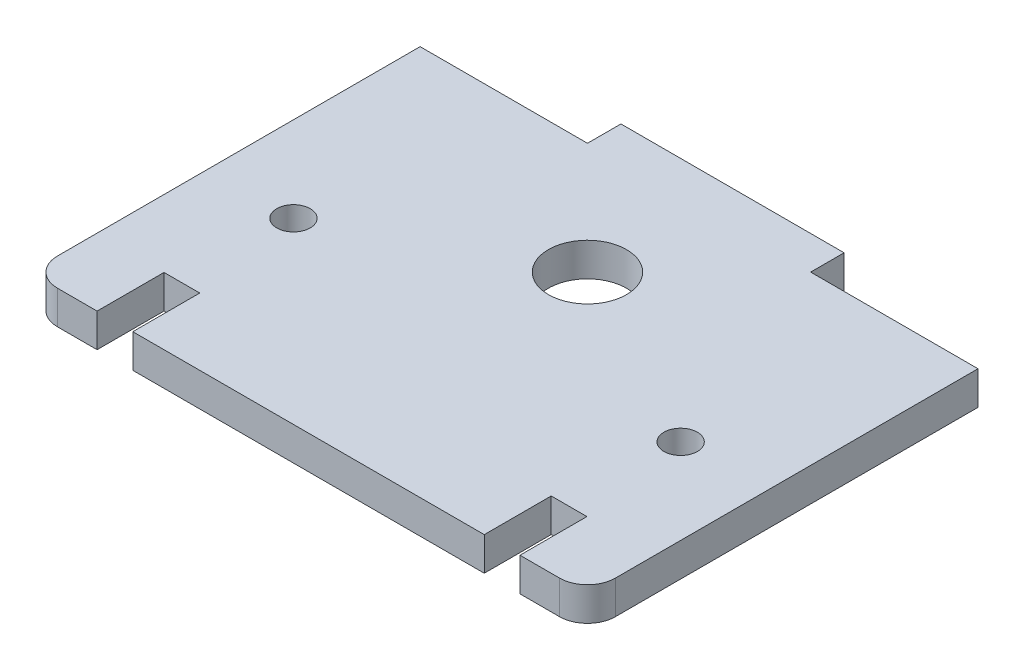
ISO-10303-21;
HEADER;
FILE_DESCRIPTION(('STEP AP214'),'2;1');
FILE_NAME('part.step','',(''),(''),'','','');
FILE_SCHEMA(('AUTOMOTIVE_DESIGN { 1 0 10303 214 1 1 1 1 }'));
ENDSEC;
DATA;
#1=APPLICATION_CONTEXT('core data for automotive mechanical design processes');
#2=APPLICATION_PROTOCOL_DEFINITION('international standard','automotive_design',2000,#1);
#3=PRODUCT_CONTEXT('',#1,'mechanical');
#4=PRODUCT('Part','Part','',(#3));
#5=PRODUCT_RELATED_PRODUCT_CATEGORY('part','',(#4));
#6=PRODUCT_DEFINITION_FORMATION('','',#4);
#7=PRODUCT_DEFINITION_CONTEXT('part definition',#1,'design');
#8=PRODUCT_DEFINITION('design','',#6,#7);
#9=PRODUCT_DEFINITION_SHAPE('','',#8);
#10=(LENGTH_UNIT() NAMED_UNIT(*) SI_UNIT(.MILLI.,.METRE.));
#11=(NAMED_UNIT(*) PLANE_ANGLE_UNIT() SI_UNIT($,.RADIAN.));
#12=(NAMED_UNIT(*) SI_UNIT($,.STERADIAN.) SOLID_ANGLE_UNIT());
#13=UNCERTAINTY_MEASURE_WITH_UNIT(LENGTH_MEASURE(1.E-05),#10,'distance_accuracy_value','');
#14=(GEOMETRIC_REPRESENTATION_CONTEXT(3) GLOBAL_UNCERTAINTY_ASSIGNED_CONTEXT((#13)) GLOBAL_UNIT_ASSIGNED_CONTEXT((#10,
#11,#12)) REPRESENTATION_CONTEXT('',''));
#15=CARTESIAN_POINT('',(0.,0.,0.));
#16=DIRECTION('',(0.,0.,1.));
#17=DIRECTION('',(1.,0.,0.));
#18=AXIS2_PLACEMENT_3D('',#15,#16,#17);
#19=CARTESIAN_POINT('',(25.,3.,-17.5));
#20=DIRECTION('',(0.,0.,1.));
#21=DIRECTION('',(1.,0.,0.));
#22=AXIS2_PLACEMENT_3D('',#19,#20,#21);
#23=PLANE('',#22);
#24=DIRECTION('',(0.,-1.,0.));
#25=VECTOR('',#24,1.);
#26=CARTESIAN_POINT('',(10.0000000000001,0.,-17.5));
#27=LINE('',#26,#25);
#28=CARTESIAN_POINT('',(10.0000000000001,3.,-17.5));
#29=VERTEX_POINT('',#28);
#30=CARTESIAN_POINT('',(10.0000000000001,0.,-17.5));
#31=VERTEX_POINT('',#30);
#32=EDGE_CURVE('E54',#29,#31,#27,.T.);
#33=ORIENTED_EDGE('',*,*,#32,.F.);
#34=DIRECTION('',(-1.,0.,0.));
#35=VECTOR('',#34,1.);
#36=CARTESIAN_POINT('',(25.,3.,-17.5));
#37=LINE('',#36,#35);
#38=CARTESIAN_POINT('',(25.,3.,-17.5));
#39=VERTEX_POINT('',#38);
#40=EDGE_CURVE('E242',#39,#29,#37,.T.);
#41=ORIENTED_EDGE('',*,*,#40,.F.);
#42=DIRECTION('',(0.,-1.,0.));
#43=VECTOR('',#42,1.);
#44=CARTESIAN_POINT('',(25.,3.,-17.5));
#45=LINE('',#44,#43);
#46=CARTESIAN_POINT('',(25.,0.,-17.5));
#47=VERTEX_POINT('',#46);
#48=EDGE_CURVE('E275',#39,#47,#45,.T.);
#49=ORIENTED_EDGE('',*,*,#48,.T.);
#50=DIRECTION('',(-1.,0.,0.));
#51=VECTOR('',#50,1.);
#52=CARTESIAN_POINT('',(25.,0.,-17.5));
#53=LINE('',#52,#51);
#54=EDGE_CURVE('E217',#47,#31,#53,.T.);
#55=ORIENTED_EDGE('',*,*,#54,.T.);
#56=EDGE_LOOP('',(#33,#41,#49,#55));
#57=FACE_BOUND('',#56,.T.);
#58=ADVANCED_FACE('F39',(#57),#23,.F.);
#59=DIRECTION('',(0.,1.,0.));
#60=VECTOR('',#59,1.);
#61=CARTESIAN_POINT('',(-10.0000000000001,0.,-17.5));
#62=LINE('',#61,#60);
#63=CARTESIAN_POINT('',(-10.0000000000001,0.,-17.5));
#64=VERTEX_POINT('',#63);
#65=CARTESIAN_POINT('',(-10.0000000000001,3.,-17.5));
#66=VERTEX_POINT('',#65);
#67=EDGE_CURVE('E62',#64,#66,#62,.T.);
#68=ORIENTED_EDGE('',*,*,#67,.F.);
#69=CARTESIAN_POINT('',(-25.,0.,-17.5));
#70=VERTEX_POINT('',#69);
#71=EDGE_CURVE('E271',#64,#70,#53,.T.);
#72=ORIENTED_EDGE('',*,*,#71,.T.);
#73=DIRECTION('',(0.,-1.,0.));
#74=VECTOR('',#73,1.);
#75=CARTESIAN_POINT('',(-25.,3.,-17.5));
#76=LINE('',#75,#74);
#77=CARTESIAN_POINT('',(-25.,3.,-17.5));
#78=VERTEX_POINT('',#77);
#79=EDGE_CURVE('E244',#78,#70,#76,.T.);
#80=ORIENTED_EDGE('',*,*,#79,.F.);
#81=EDGE_CURVE('E241',#66,#78,#37,.T.);
#82=ORIENTED_EDGE('',*,*,#81,.F.);
#83=EDGE_LOOP('',(#68,#72,#80,#82));
#84=FACE_BOUND('',#83,.T.);
#85=ADVANCED_FACE('F392',(#84),#23,.F.);
#86=CARTESIAN_POINT('',(22.5,3.,15.));
#87=DIRECTION('',(0.,1.,0.));
#88=DIRECTION('',(0.,0.,1.));
#89=AXIS2_PLACEMENT_3D('',#86,#87,#88);
#90=PLANE('',#89);
#91=CARTESIAN_POINT('',(17.35,3.,1.5));
#92=DIRECTION('',(0.,1.,0.));
#93=DIRECTION('',(0.,0.,-1.));
#94=AXIS2_PLACEMENT_3D('',#91,#92,#93);
#95=CIRCLE('',#94,1.5);
#96=CARTESIAN_POINT('',(17.35,3.,0.));
#97=VERTEX_POINT('',#96);
#98=EDGE_CURVE('E201',#97,#97,#95,.T.);
#99=ORIENTED_EDGE('',*,*,#98,.F.);
#100=EDGE_LOOP('',(#99));
#101=FACE_BOUND('',#100,.T.);
#102=DIRECTION('',(0.,0.,1.));
#103=VECTOR('',#102,1.);
#104=CARTESIAN_POINT('',(-25.,3.,15.));
#105=LINE('',#104,#103);
#106=CARTESIAN_POINT('',(-25.,3.,15.));
#107=VERTEX_POINT('',#106);
#108=EDGE_CURVE('E213',#78,#107,#105,.T.);
#109=ORIENTED_EDGE('',*,*,#108,.T.);
#110=CARTESIAN_POINT('',(-22.5,3.,15.));
#111=DIRECTION('',(0.,1.,0.));
#112=DIRECTION('',(0.,0.,-1.));
#113=AXIS2_PLACEMENT_3D('',#110,#111,#112);
#114=CIRCLE('',#113,2.5);
#115=CARTESIAN_POINT('',(-22.5,3.,17.5));
#116=VERTEX_POINT('',#115);
#117=EDGE_CURVE('E216',#107,#116,#114,.T.);
#118=ORIENTED_EDGE('',*,*,#117,.T.);
#119=DIRECTION('',(1.,0.,0.));
#120=VECTOR('',#119,1.);
#121=CARTESIAN_POINT('',(-18.95,3.,17.5));
#122=LINE('',#121,#120);
#123=CARTESIAN_POINT('',(-18.95,3.,17.5));
#124=VERTEX_POINT('',#123);
#125=EDGE_CURVE('E219',#116,#124,#122,.T.);
#126=ORIENTED_EDGE('',*,*,#125,.T.);
#127=DIRECTION('',(0.,0.,-1.));
#128=VECTOR('',#127,1.);
#129=CARTESIAN_POINT('',(-18.95,3.,17.5));
#130=LINE('',#129,#128);
#131=CARTESIAN_POINT('',(-18.95,3.,11.5));
#132=VERTEX_POINT('',#131);
#133=EDGE_CURVE('E221',#124,#132,#130,.T.);
#134=ORIENTED_EDGE('',*,*,#133,.T.);
#135=DIRECTION('',(1.,0.,0.));
#136=VECTOR('',#135,1.);
#137=CARTESIAN_POINT('',(-18.95,3.,11.5));
#138=LINE('',#137,#136);
#139=CARTESIAN_POINT('',(-15.75,3.,11.5));
#140=VERTEX_POINT('',#139);
#141=EDGE_CURVE('E223',#132,#140,#138,.T.);
#142=ORIENTED_EDGE('',*,*,#141,.T.);
#143=DIRECTION('',(0.,0.,1.));
#144=VECTOR('',#143,1.);
#145=CARTESIAN_POINT('',(-15.75,3.,11.5));
#146=LINE('',#145,#144);
#147=CARTESIAN_POINT('',(-15.75,3.,17.5));
#148=VERTEX_POINT('',#147);
#149=EDGE_CURVE('E225',#140,#148,#146,.T.);
#150=ORIENTED_EDGE('',*,*,#149,.T.);
#151=DIRECTION('',(1.,0.,0.));
#152=VECTOR('',#151,1.);
#153=CARTESIAN_POINT('',(15.75,3.,17.5));
#154=LINE('',#153,#152);
#155=CARTESIAN_POINT('',(15.75,3.,17.5));
#156=VERTEX_POINT('',#155);
#157=EDGE_CURVE('E227',#148,#156,#154,.T.);
#158=ORIENTED_EDGE('',*,*,#157,.T.);
#159=DIRECTION('',(0.,0.,-1.));
#160=VECTOR('',#159,1.);
#161=CARTESIAN_POINT('',(15.75,3.,11.5));
#162=LINE('',#161,#160);
#163=CARTESIAN_POINT('',(15.75,3.,11.5));
#164=VERTEX_POINT('',#163);
#165=EDGE_CURVE('E229',#156,#164,#162,.T.);
#166=ORIENTED_EDGE('',*,*,#165,.T.);
#167=DIRECTION('',(1.,0.,0.));
#168=VECTOR('',#167,1.);
#169=CARTESIAN_POINT('',(18.95,3.,11.5));
#170=LINE('',#169,#168);
#171=CARTESIAN_POINT('',(18.95,3.,11.5));
#172=VERTEX_POINT('',#171);
#173=EDGE_CURVE('E231',#164,#172,#170,.T.);
#174=ORIENTED_EDGE('',*,*,#173,.T.);
#175=DIRECTION('',(0.,0.,1.));
#176=VECTOR('',#175,1.);
#177=CARTESIAN_POINT('',(18.95,3.,17.5));
#178=LINE('',#177,#176);
#179=CARTESIAN_POINT('',(18.95,3.,17.5));
#180=VERTEX_POINT('',#179);
#181=EDGE_CURVE('E233',#172,#180,#178,.T.);
#182=ORIENTED_EDGE('',*,*,#181,.T.);
#183=DIRECTION('',(1.,0.,0.));
#184=VECTOR('',#183,1.);
#185=CARTESIAN_POINT('',(22.5,3.,17.5));
#186=LINE('',#185,#184);
#187=CARTESIAN_POINT('',(22.5,3.,17.5));
#188=VERTEX_POINT('',#187);
#189=EDGE_CURVE('E235',#180,#188,#186,.T.);
#190=ORIENTED_EDGE('',*,*,#189,.T.);
#191=CARTESIAN_POINT('',(22.5,3.,15.));
#192=DIRECTION('',(0.,1.,0.));
#193=DIRECTION('',(0.,0.,1.));
#194=AXIS2_PLACEMENT_3D('',#191,#192,#193);
#195=CIRCLE('',#194,2.5);
#196=CARTESIAN_POINT('',(25.,3.,15.));
#197=VERTEX_POINT('',#196);
#198=EDGE_CURVE('E237',#188,#197,#195,.T.);
#199=ORIENTED_EDGE('',*,*,#198,.T.);
#200=DIRECTION('',(0.,0.,-1.));
#201=VECTOR('',#200,1.);
#202=CARTESIAN_POINT('',(25.,3.,15.));
#203=LINE('',#202,#201);
#204=EDGE_CURVE('E239',#197,#39,#203,.T.);
#205=ORIENTED_EDGE('',*,*,#204,.T.);
#206=ORIENTED_EDGE('',*,*,#40,.T.);
#207=DIRECTION('',(0.,0.,1.));
#208=VECTOR('',#207,1.);
#209=CARTESIAN_POINT('',(10.0000000000001,3.,-20.5));
#210=LINE('',#209,#208);
#211=CARTESIAN_POINT('',(10.0000000000001,3.,-20.5));
#212=VERTEX_POINT('',#211);
#213=EDGE_CURVE('E341',#212,#29,#210,.T.);
#214=ORIENTED_EDGE('',*,*,#213,.F.);
#215=DIRECTION('',(1.,0.,0.));
#216=VECTOR('',#215,1.);
#217=CARTESIAN_POINT('',(-10.0000000000001,3.,-20.5));
#218=LINE('',#217,#216);
#219=CARTESIAN_POINT('',(-10.0000000000001,3.,-20.5));
#220=VERTEX_POINT('',#219);
#221=EDGE_CURVE('E183',#220,#212,#218,.T.);
#222=ORIENTED_EDGE('',*,*,#221,.F.);
#223=DIRECTION('',(0.,0.,1.));
#224=VECTOR('',#223,1.);
#225=CARTESIAN_POINT('',(-10.0000000000001,3.,-20.5));
#226=LINE('',#225,#224);
#227=EDGE_CURVE('E194',#220,#66,#226,.T.);
#228=ORIENTED_EDGE('',*,*,#227,.T.);
#229=ORIENTED_EDGE('',*,*,#81,.T.);
#230=EDGE_LOOP('',(#109,#118,#126,#134,#142,#150,#158,#166,#174,#182,#190,#199,#205,#206,#214,
#222,#228,#229));
#231=FACE_BOUND('',#230,.T.);
#232=CARTESIAN_POINT('',(-17.35,3.,1.5));
#233=DIRECTION('',(0.,1.,0.));
#234=DIRECTION('',(0.,0.,1.));
#235=AXIS2_PLACEMENT_3D('',#232,#233,#234);
#236=CIRCLE('',#235,1.5);
#237=CARTESIAN_POINT('',(-17.35,3.,3.00000000000001));
#238=VERTEX_POINT('',#237);
#239=EDGE_CURVE('E207',#238,#238,#236,.T.);
#240=ORIENTED_EDGE('',*,*,#239,.F.);
#241=EDGE_LOOP('',(#240));
#242=FACE_BOUND('',#241,.T.);
#243=CARTESIAN_POINT('',(0.,3.,-7.5));
#244=DIRECTION('',(0.,1.,0.));
#245=DIRECTION('',(0.,0.,1.));
#246=AXIS2_PLACEMENT_3D('',#243,#244,#245);
#247=CIRCLE('',#246,3.5);
#248=CARTESIAN_POINT('',(0.,3.,-4.));
#249=VERTEX_POINT('',#248);
#250=EDGE_CURVE('E192',#249,#249,#247,.T.);
#251=ORIENTED_EDGE('',*,*,#250,.F.);
#252=EDGE_LOOP('',(#251));
#253=FACE_BOUND('',#252,.T.);
#254=ADVANCED_FACE('F328',(#101,#231,#242,#253),#90,.T.);
#255=CARTESIAN_POINT('',(22.5,0.,15.));
#256=DIRECTION('',(0.,1.,0.));
#257=DIRECTION('',(0.,0.,1.));
#258=AXIS2_PLACEMENT_3D('',#255,#256,#257);
#259=PLANE('',#258);
#260=DIRECTION('',(0.,0.,1.));
#261=VECTOR('',#260,1.);
#262=CARTESIAN_POINT('',(-25.,0.,15.));
#263=LINE('',#262,#261);
#264=CARTESIAN_POINT('',(-25.,0.,15.));
#265=VERTEX_POINT('',#264);
#266=EDGE_CURVE('E210',#70,#265,#263,.T.);
#267=ORIENTED_EDGE('',*,*,#266,.F.);
#268=ORIENTED_EDGE('',*,*,#71,.F.);
#269=DIRECTION('',(0.,0.,1.));
#270=VECTOR('',#269,1.);
#271=CARTESIAN_POINT('',(-10.0000000000001,0.,-20.5));
#272=LINE('',#271,#270);
#273=CARTESIAN_POINT('',(-10.0000000000001,0.,-20.5));
#274=VERTEX_POINT('',#273);
#275=EDGE_CURVE('E174',#274,#64,#272,.T.);
#276=ORIENTED_EDGE('',*,*,#275,.F.);
#277=DIRECTION('',(-1.,0.,0.));
#278=VECTOR('',#277,1.);
#279=CARTESIAN_POINT('',(-10.0000000000001,0.,-20.5));
#280=LINE('',#279,#278);
#281=CARTESIAN_POINT('',(10.0000000000001,0.,-20.5));
#282=VERTEX_POINT('',#281);
#283=EDGE_CURVE('E165',#282,#274,#280,.T.);
#284=ORIENTED_EDGE('',*,*,#283,.F.);
#285=DIRECTION('',(0.,0.,1.));
#286=VECTOR('',#285,1.);
#287=CARTESIAN_POINT('',(10.0000000000001,0.,-20.5));
#288=LINE('',#287,#286);
#289=EDGE_CURVE('E172',#282,#31,#288,.T.);
#290=ORIENTED_EDGE('',*,*,#289,.T.);
#291=ORIENTED_EDGE('',*,*,#54,.F.);
#292=DIRECTION('',(0.,0.,-1.));
#293=VECTOR('',#292,1.);
#294=CARTESIAN_POINT('',(25.,0.,15.));
#295=LINE('',#294,#293);
#296=CARTESIAN_POINT('',(25.,0.,15.));
#297=VERTEX_POINT('',#296);
#298=EDGE_CURVE('E269',#297,#47,#295,.T.);
#299=ORIENTED_EDGE('',*,*,#298,.F.);
#300=CARTESIAN_POINT('',(22.5,0.,15.));
#301=DIRECTION('',(0.,1.,0.));
#302=DIRECTION('',(0.,0.,1.));
#303=AXIS2_PLACEMENT_3D('',#300,#301,#302);
#304=CIRCLE('',#303,2.5);
#305=CARTESIAN_POINT('',(22.5,0.,17.5));
#306=VERTEX_POINT('',#305);
#307=EDGE_CURVE('E267',#306,#297,#304,.T.);
#308=ORIENTED_EDGE('',*,*,#307,.F.);
#309=DIRECTION('',(1.,0.,0.));
#310=VECTOR('',#309,1.);
#311=CARTESIAN_POINT('',(22.5,0.,17.5));
#312=LINE('',#311,#310);
#313=CARTESIAN_POINT('',(18.95,0.,17.5));
#314=VERTEX_POINT('',#313);
#315=EDGE_CURVE('E265',#314,#306,#312,.T.);
#316=ORIENTED_EDGE('',*,*,#315,.F.);
#317=DIRECTION('',(0.,0.,1.));
#318=VECTOR('',#317,1.);
#319=CARTESIAN_POINT('',(18.95,0.,17.5));
#320=LINE('',#319,#318);
#321=CARTESIAN_POINT('',(18.95,0.,11.5));
#322=VERTEX_POINT('',#321);
#323=EDGE_CURVE('E263',#322,#314,#320,.T.);
#324=ORIENTED_EDGE('',*,*,#323,.F.);
#325=DIRECTION('',(1.,0.,0.));
#326=VECTOR('',#325,1.);
#327=CARTESIAN_POINT('',(18.95,0.,11.5));
#328=LINE('',#327,#326);
#329=CARTESIAN_POINT('',(15.75,0.,11.5));
#330=VERTEX_POINT('',#329);
#331=EDGE_CURVE('E261',#330,#322,#328,.T.);
#332=ORIENTED_EDGE('',*,*,#331,.F.);
#333=DIRECTION('',(0.,0.,-1.));
#334=VECTOR('',#333,1.);
#335=CARTESIAN_POINT('',(15.75,0.,11.5));
#336=LINE('',#335,#334);
#337=CARTESIAN_POINT('',(15.75,0.,17.5));
#338=VERTEX_POINT('',#337);
#339=EDGE_CURVE('E259',#338,#330,#336,.T.);
#340=ORIENTED_EDGE('',*,*,#339,.F.);
#341=DIRECTION('',(1.,0.,0.));
#342=VECTOR('',#341,1.);
#343=CARTESIAN_POINT('',(15.75,0.,17.5));
#344=LINE('',#343,#342);
#345=CARTESIAN_POINT('',(-15.75,0.,17.5));
#346=VERTEX_POINT('',#345);
#347=EDGE_CURVE('E257',#346,#338,#344,.T.);
#348=ORIENTED_EDGE('',*,*,#347,.F.);
#349=DIRECTION('',(0.,0.,1.));
#350=VECTOR('',#349,1.);
#351=CARTESIAN_POINT('',(-15.75,0.,11.5));
#352=LINE('',#351,#350);
#353=CARTESIAN_POINT('',(-15.75,0.,11.5));
#354=VERTEX_POINT('',#353);
#355=EDGE_CURVE('E255',#354,#346,#352,.T.);
#356=ORIENTED_EDGE('',*,*,#355,.F.);
#357=DIRECTION('',(1.,0.,0.));
#358=VECTOR('',#357,1.);
#359=CARTESIAN_POINT('',(-18.95,0.,11.5));
#360=LINE('',#359,#358);
#361=CARTESIAN_POINT('',(-18.95,0.,11.5));
#362=VERTEX_POINT('',#361);
#363=EDGE_CURVE('E253',#362,#354,#360,.T.);
#364=ORIENTED_EDGE('',*,*,#363,.F.);
#365=DIRECTION('',(0.,0.,-1.));
#366=VECTOR('',#365,1.);
#367=CARTESIAN_POINT('',(-18.95,0.,17.5));
#368=LINE('',#367,#366);
#369=CARTESIAN_POINT('',(-18.95,0.,17.5));
#370=VERTEX_POINT('',#369);
#371=EDGE_CURVE('E251',#370,#362,#368,.T.);
#372=ORIENTED_EDGE('',*,*,#371,.F.);
#373=DIRECTION('',(1.,0.,0.));
#374=VECTOR('',#373,1.);
#375=CARTESIAN_POINT('',(-18.95,0.,17.5));
#376=LINE('',#375,#374);
#377=CARTESIAN_POINT('',(-22.5,0.,17.5));
#378=VERTEX_POINT('',#377);
#379=EDGE_CURVE('E249',#378,#370,#376,.T.);
#380=ORIENTED_EDGE('',*,*,#379,.F.);
#381=CARTESIAN_POINT('',(-22.5,0.,15.));
#382=DIRECTION('',(0.,1.,0.));
#383=DIRECTION('',(0.,0.,-1.));
#384=AXIS2_PLACEMENT_3D('',#381,#382,#383);
#385=CIRCLE('',#384,2.5);
#386=EDGE_CURVE('E247',#265,#378,#385,.T.);
#387=ORIENTED_EDGE('',*,*,#386,.F.);
#388=EDGE_LOOP('',(#267,#268,#276,#284,#290,#291,#299,#308,#316,#324,#332,#340,#348,#356,#364,
#372,#380,#387));
#389=FACE_BOUND('',#388,.T.);
#390=CARTESIAN_POINT('',(-17.35,0.,1.5));
#391=DIRECTION('',(0.,1.,0.));
#392=DIRECTION('',(0.,0.,1.));
#393=AXIS2_PLACEMENT_3D('',#390,#391,#392);
#394=CIRCLE('',#393,1.5);
#395=CARTESIAN_POINT('',(-17.35,0.,3.00000000000001));
#396=VERTEX_POINT('',#395);
#397=EDGE_CURVE('E204',#396,#396,#394,.T.);
#398=ORIENTED_EDGE('',*,*,#397,.T.);
#399=EDGE_LOOP('',(#398));
#400=FACE_BOUND('',#399,.T.);
#401=CARTESIAN_POINT('',(17.35,0.,1.5));
#402=DIRECTION('',(0.,1.,0.));
#403=DIRECTION('',(0.,0.,-1.));
#404=AXIS2_PLACEMENT_3D('',#401,#402,#403);
#405=CIRCLE('',#404,1.5);
#406=CARTESIAN_POINT('',(17.35,0.,0.));
#407=VERTEX_POINT('',#406);
#408=EDGE_CURVE('E199',#407,#407,#405,.T.);
#409=ORIENTED_EDGE('',*,*,#408,.T.);
#410=EDGE_LOOP('',(#409));
#411=FACE_BOUND('',#410,.T.);
#412=CARTESIAN_POINT('',(0.,0.,-7.5));
#413=DIRECTION('',(0.,1.,0.));
#414=DIRECTION('',(0.,0.,1.));
#415=AXIS2_PLACEMENT_3D('',#412,#413,#414);
#416=CIRCLE('',#415,3.5);
#417=CARTESIAN_POINT('',(0.,0.,-4.));
#418=VERTEX_POINT('',#417);
#419=EDGE_CURVE('E189',#418,#418,#416,.T.);
#420=ORIENTED_EDGE('',*,*,#419,.T.);
#421=EDGE_LOOP('',(#420));
#422=FACE_BOUND('',#421,.T.);
#423=ADVANCED_FACE('F168',(#389,#400,#411,#422),#259,.F.);
#424=CARTESIAN_POINT('',(-25.,3.,15.));
#425=DIRECTION('',(1.,0.,0.));
#426=DIRECTION('',(0.,0.,-1.));
#427=AXIS2_PLACEMENT_3D('',#424,#425,#426);
#428=PLANE('',#427);
#429=ORIENTED_EDGE('',*,*,#266,.T.);
#430=DIRECTION('',(0.,-1.,0.));
#431=VECTOR('',#430,1.);
#432=CARTESIAN_POINT('',(-25.,3.,15.));
#433=LINE('',#432,#431);
#434=EDGE_CURVE('E11',#107,#265,#433,.T.);
#435=ORIENTED_EDGE('',*,*,#434,.F.);
#436=ORIENTED_EDGE('',*,*,#108,.F.);
#437=ORIENTED_EDGE('',*,*,#79,.T.);
#438=EDGE_LOOP('',(#429,#435,#436,#437));
#439=FACE_BOUND('',#438,.T.);
#440=ADVANCED_FACE('F41',(#439),#428,.F.);
#441=CARTESIAN_POINT('',(-22.5,3.,15.));
#442=DIRECTION('',(0.,-1.,0.));
#443=DIRECTION('',(0.,0.,-1.));
#444=AXIS2_PLACEMENT_3D('',#441,#442,#443);
#445=CYLINDRICAL_SURFACE('',#444,2.5);
#446=ORIENTED_EDGE('',*,*,#386,.T.);
#447=DIRECTION('',(0.,-1.,0.));
#448=VECTOR('',#447,1.);
#449=CARTESIAN_POINT('',(-22.5,3.,17.5));
#450=LINE('',#449,#448);
#451=EDGE_CURVE('E47',#116,#378,#450,.T.);
#452=ORIENTED_EDGE('',*,*,#451,.F.);
#453=ORIENTED_EDGE('',*,*,#117,.F.);
#454=ORIENTED_EDGE('',*,*,#434,.T.);
#455=EDGE_LOOP('',(#446,#452,#453,#454));
#456=FACE_BOUND('',#455,.T.);
#457=ADVANCED_FACE('F333',(#456),#445,.T.);
#458=CARTESIAN_POINT('',(-18.95,3.,17.5));
#459=DIRECTION('',(0.,0.,-1.));
#460=DIRECTION('',(-1.,0.,0.));
#461=AXIS2_PLACEMENT_3D('',#458,#459,#460);
#462=PLANE('',#461);
#463=ORIENTED_EDGE('',*,*,#379,.T.);
#464=DIRECTION('',(0.,-1.,0.));
#465=VECTOR('',#464,1.);
#466=CARTESIAN_POINT('',(-18.95,3.,17.5));
#467=LINE('',#466,#465);
#468=EDGE_CURVE('E305',#124,#370,#467,.T.);
#469=ORIENTED_EDGE('',*,*,#468,.F.);
#470=ORIENTED_EDGE('',*,*,#125,.F.);
#471=ORIENTED_EDGE('',*,*,#451,.T.);
#472=EDGE_LOOP('',(#463,#469,#470,#471));
#473=FACE_BOUND('',#472,.T.);
#474=ADVANCED_FACE('F312',(#473),#462,.F.);
#475=CARTESIAN_POINT('',(-18.95,3.,17.5));
#476=DIRECTION('',(-1.,0.,0.));
#477=DIRECTION('',(0.,0.,1.));
#478=AXIS2_PLACEMENT_3D('',#475,#476,#477);
#479=PLANE('',#478);
#480=ORIENTED_EDGE('',*,*,#371,.T.);
#481=DIRECTION('',(0.,-1.,0.));
#482=VECTOR('',#481,1.);
#483=CARTESIAN_POINT('',(-18.95,3.,11.5));
#484=LINE('',#483,#482);
#485=EDGE_CURVE('E302',#132,#362,#484,.T.);
#486=ORIENTED_EDGE('',*,*,#485,.F.);
#487=ORIENTED_EDGE('',*,*,#133,.F.);
#488=ORIENTED_EDGE('',*,*,#468,.T.);
#489=EDGE_LOOP('',(#480,#486,#487,#488));
#490=FACE_BOUND('',#489,.T.);
#491=ADVANCED_FACE('F320',(#490),#479,.F.);
#492=CARTESIAN_POINT('',(-18.95,3.,11.5));
#493=DIRECTION('',(0.,0.,-1.));
#494=DIRECTION('',(-1.,0.,0.));
#495=AXIS2_PLACEMENT_3D('',#492,#493,#494);
#496=PLANE('',#495);
#497=ORIENTED_EDGE('',*,*,#363,.T.);
#498=DIRECTION('',(0.,-1.,0.));
#499=VECTOR('',#498,1.);
#500=CARTESIAN_POINT('',(-15.75,3.,11.5));
#501=LINE('',#500,#499);
#502=EDGE_CURVE('E299',#140,#354,#501,.T.);
#503=ORIENTED_EDGE('',*,*,#502,.F.);
#504=ORIENTED_EDGE('',*,*,#141,.F.);
#505=ORIENTED_EDGE('',*,*,#485,.T.);
#506=EDGE_LOOP('',(#497,#503,#504,#505));
#507=FACE_BOUND('',#506,.T.);
#508=ADVANCED_FACE('F324',(#507),#496,.F.);
#509=CARTESIAN_POINT('',(-15.75,3.,11.5));
#510=DIRECTION('',(1.,0.,0.));
#511=DIRECTION('',(0.,0.,-1.));
#512=AXIS2_PLACEMENT_3D('',#509,#510,#511);
#513=PLANE('',#512);
#514=ORIENTED_EDGE('',*,*,#355,.T.);
#515=DIRECTION('',(0.,-1.,0.));
#516=VECTOR('',#515,1.);
#517=CARTESIAN_POINT('',(-15.75,3.,17.5));
#518=LINE('',#517,#516);
#519=EDGE_CURVE('E296',#148,#346,#518,.T.);
#520=ORIENTED_EDGE('',*,*,#519,.F.);
#521=ORIENTED_EDGE('',*,*,#149,.F.);
#522=ORIENTED_EDGE('',*,*,#502,.T.);
#523=EDGE_LOOP('',(#514,#520,#521,#522));
#524=FACE_BOUND('',#523,.T.);
#525=ADVANCED_FACE('F382',(#524),#513,.F.);
#526=CARTESIAN_POINT('',(15.75,3.,17.5));
#527=DIRECTION('',(0.,0.,-1.));
#528=DIRECTION('',(-1.,0.,0.));
#529=AXIS2_PLACEMENT_3D('',#526,#527,#528);
#530=PLANE('',#529);
#531=ORIENTED_EDGE('',*,*,#347,.T.);
#532=DIRECTION('',(0.,-1.,0.));
#533=VECTOR('',#532,1.);
#534=CARTESIAN_POINT('',(15.75,3.,17.5));
#535=LINE('',#534,#533);
#536=EDGE_CURVE('E293',#156,#338,#535,.T.);
#537=ORIENTED_EDGE('',*,*,#536,.F.);
#538=ORIENTED_EDGE('',*,*,#157,.F.);
#539=ORIENTED_EDGE('',*,*,#519,.T.);
#540=EDGE_LOOP('',(#531,#537,#538,#539));
#541=FACE_BOUND('',#540,.T.);
#542=ADVANCED_FACE('F379',(#541),#530,.F.);
#543=CARTESIAN_POINT('',(15.75,3.,11.5));
#544=DIRECTION('',(-1.,0.,0.));
#545=DIRECTION('',(0.,0.,1.));
#546=AXIS2_PLACEMENT_3D('',#543,#544,#545);
#547=PLANE('',#546);
#548=ORIENTED_EDGE('',*,*,#339,.T.);
#549=DIRECTION('',(0.,-1.,0.));
#550=VECTOR('',#549,1.);
#551=CARTESIAN_POINT('',(15.75,3.,11.5));
#552=LINE('',#551,#550);
#553=EDGE_CURVE('E290',#164,#330,#552,.T.);
#554=ORIENTED_EDGE('',*,*,#553,.F.);
#555=ORIENTED_EDGE('',*,*,#165,.F.);
#556=ORIENTED_EDGE('',*,*,#536,.T.);
#557=EDGE_LOOP('',(#548,#554,#555,#556));
#558=FACE_BOUND('',#557,.T.);
#559=ADVANCED_FACE('F375',(#558),#547,.F.);
#560=CARTESIAN_POINT('',(18.95,3.,11.5));
#561=DIRECTION('',(0.,0.,-1.));
#562=DIRECTION('',(-1.,0.,0.));
#563=AXIS2_PLACEMENT_3D('',#560,#561,#562);
#564=PLANE('',#563);
#565=ORIENTED_EDGE('',*,*,#331,.T.);
#566=DIRECTION('',(0.,-1.,0.));
#567=VECTOR('',#566,1.);
#568=CARTESIAN_POINT('',(18.95,3.,11.5));
#569=LINE('',#568,#567);
#570=EDGE_CURVE('E287',#172,#322,#569,.T.);
#571=ORIENTED_EDGE('',*,*,#570,.F.);
#572=ORIENTED_EDGE('',*,*,#173,.F.);
#573=ORIENTED_EDGE('',*,*,#553,.T.);
#574=EDGE_LOOP('',(#565,#571,#572,#573));
#575=FACE_BOUND('',#574,.T.);
#576=ADVANCED_FACE('F371',(#575),#564,.F.);
#577=CARTESIAN_POINT('',(18.95,3.,17.5));
#578=DIRECTION('',(1.,0.,0.));
#579=DIRECTION('',(0.,0.,-1.));
#580=AXIS2_PLACEMENT_3D('',#577,#578,#579);
#581=PLANE('',#580);
#582=ORIENTED_EDGE('',*,*,#323,.T.);
#583=DIRECTION('',(0.,-1.,0.));
#584=VECTOR('',#583,1.);
#585=CARTESIAN_POINT('',(18.95,3.,17.5));
#586=LINE('',#585,#584);
#587=EDGE_CURVE('E284',#180,#314,#586,.T.);
#588=ORIENTED_EDGE('',*,*,#587,.F.);
#589=ORIENTED_EDGE('',*,*,#181,.F.);
#590=ORIENTED_EDGE('',*,*,#570,.T.);
#591=EDGE_LOOP('',(#582,#588,#589,#590));
#592=FACE_BOUND('',#591,.T.);
#593=ADVANCED_FACE('F366',(#592),#581,.F.);
#594=CARTESIAN_POINT('',(22.5,3.,17.5));
#595=DIRECTION('',(0.,0.,-1.));
#596=DIRECTION('',(-1.,0.,0.));
#597=AXIS2_PLACEMENT_3D('',#594,#595,#596);
#598=PLANE('',#597);
#599=ORIENTED_EDGE('',*,*,#315,.T.);
#600=DIRECTION('',(0.,-1.,0.));
#601=VECTOR('',#600,1.);
#602=CARTESIAN_POINT('',(22.5,3.,17.5));
#603=LINE('',#602,#601);
#604=EDGE_CURVE('E281',#188,#306,#603,.T.);
#605=ORIENTED_EDGE('',*,*,#604,.F.);
#606=ORIENTED_EDGE('',*,*,#189,.F.);
#607=ORIENTED_EDGE('',*,*,#587,.T.);
#608=EDGE_LOOP('',(#599,#605,#606,#607));
#609=FACE_BOUND('',#608,.T.);
#610=ADVANCED_FACE('F360',(#609),#598,.F.);
#611=CARTESIAN_POINT('',(22.5,3.,15.));
#612=DIRECTION('',(0.,-1.,0.));
#613=DIRECTION('',(0.,0.,-1.));
#614=AXIS2_PLACEMENT_3D('',#611,#612,#613);
#615=CYLINDRICAL_SURFACE('',#614,2.5);
#616=ORIENTED_EDGE('',*,*,#307,.T.);
#617=DIRECTION('',(0.,-1.,0.));
#618=VECTOR('',#617,1.);
#619=CARTESIAN_POINT('',(25.,3.,15.));
#620=LINE('',#619,#618);
#621=EDGE_CURVE('E278',#197,#297,#620,.T.);
#622=ORIENTED_EDGE('',*,*,#621,.F.);
#623=ORIENTED_EDGE('',*,*,#198,.F.);
#624=ORIENTED_EDGE('',*,*,#604,.T.);
#625=EDGE_LOOP('',(#616,#622,#623,#624));
#626=FACE_BOUND('',#625,.T.);
#627=ADVANCED_FACE('F356',(#626),#615,.T.);
#628=CARTESIAN_POINT('',(25.,3.,15.));
#629=DIRECTION('',(-1.,0.,0.));
#630=DIRECTION('',(0.,0.,1.));
#631=AXIS2_PLACEMENT_3D('',#628,#629,#630);
#632=PLANE('',#631);
#633=ORIENTED_EDGE('',*,*,#298,.T.);
#634=ORIENTED_EDGE('',*,*,#48,.F.);
#635=ORIENTED_EDGE('',*,*,#204,.F.);
#636=ORIENTED_EDGE('',*,*,#621,.T.);
#637=EDGE_LOOP('',(#633,#634,#635,#636));
#638=FACE_BOUND('',#637,.T.);
#639=ADVANCED_FACE('F352',(#638),#632,.F.);
#640=CARTESIAN_POINT('',(-17.35,3.,1.5));
#641=DIRECTION('',(0.,-1.,0.));
#642=DIRECTION('',(0.,0.,-1.));
#643=AXIS2_PLACEMENT_3D('',#640,#641,#642);
#644=CYLINDRICAL_SURFACE('',#643,1.5);
#645=ORIENTED_EDGE('',*,*,#239,.T.);
#646=EDGE_LOOP('',(#645));
#647=FACE_BOUND('',#646,.T.);
#648=ORIENTED_EDGE('',*,*,#397,.F.);
#649=EDGE_LOOP('',(#648));
#650=FACE_BOUND('',#649,.T.);
#651=ADVANCED_FACE('F403',(#647,#650),#644,.F.);
#652=CARTESIAN_POINT('',(17.35,3.,1.5));
#653=DIRECTION('',(0.,-1.,0.));
#654=DIRECTION('',(0.,0.,-1.));
#655=AXIS2_PLACEMENT_3D('',#652,#653,#654);
#656=CYLINDRICAL_SURFACE('',#655,1.5);
#657=ORIENTED_EDGE('',*,*,#98,.T.);
#658=EDGE_LOOP('',(#657));
#659=FACE_BOUND('',#658,.T.);
#660=ORIENTED_EDGE('',*,*,#408,.F.);
#661=EDGE_LOOP('',(#660));
#662=FACE_BOUND('',#661,.T.);
#663=ADVANCED_FACE('F449',(#659,#662),#656,.F.);
#664=CARTESIAN_POINT('',(0.,3.,-7.5));
#665=DIRECTION('',(0.,-1.,0.));
#666=DIRECTION('',(0.,0.,-1.));
#667=AXIS2_PLACEMENT_3D('',#664,#665,#666);
#668=CYLINDRICAL_SURFACE('',#667,3.5);
#669=ORIENTED_EDGE('',*,*,#250,.T.);
#670=EDGE_LOOP('',(#669));
#671=FACE_BOUND('',#670,.T.);
#672=ORIENTED_EDGE('',*,*,#419,.F.);
#673=EDGE_LOOP('',(#672));
#674=FACE_BOUND('',#673,.T.);
#675=ADVANCED_FACE('F457',(#671,#674),#668,.F.);
#676=CARTESIAN_POINT('',(10.0000000000001,0.,-20.5));
#677=DIRECTION('',(-1.,0.,0.));
#678=DIRECTION('',(0.,0.,1.));
#679=AXIS2_PLACEMENT_3D('',#676,#677,#678);
#680=PLANE('',#679);
#681=ORIENTED_EDGE('',*,*,#32,.T.);
#682=ORIENTED_EDGE('',*,*,#289,.F.);
#683=DIRECTION('',(0.,-1.,0.));
#684=VECTOR('',#683,1.);
#685=CARTESIAN_POINT('',(10.0000000000001,0.,-20.5));
#686=LINE('',#685,#684);
#687=EDGE_CURVE('E178',#212,#282,#686,.T.);
#688=ORIENTED_EDGE('',*,*,#687,.F.);
#689=ORIENTED_EDGE('',*,*,#213,.T.);
#690=EDGE_LOOP('',(#681,#682,#688,#689));
#691=FACE_BOUND('',#690,.T.);
#692=ADVANCED_FACE('F188',(#691),#680,.F.);
#693=CARTESIAN_POINT('',(-10.0000000000001,0.,-20.5));
#694=DIRECTION('',(1.,0.,0.));
#695=DIRECTION('',(0.,0.,-1.));
#696=AXIS2_PLACEMENT_3D('',#693,#694,#695);
#697=PLANE('',#696);
#698=ORIENTED_EDGE('',*,*,#67,.T.);
#699=ORIENTED_EDGE('',*,*,#227,.F.);
#700=DIRECTION('',(0.,1.,0.));
#701=VECTOR('',#700,1.);
#702=CARTESIAN_POINT('',(-10.0000000000001,0.,-20.5));
#703=LINE('',#702,#701);
#704=EDGE_CURVE('E177',#274,#220,#703,.T.);
#705=ORIENTED_EDGE('',*,*,#704,.F.);
#706=ORIENTED_EDGE('',*,*,#275,.T.);
#707=EDGE_LOOP('',(#698,#699,#705,#706));
#708=FACE_BOUND('',#707,.T.);
#709=ADVANCED_FACE('F337',(#708),#697,.F.);
#710=CARTESIAN_POINT('',(0.,0.,-20.5));
#711=DIRECTION('',(0.,0.,-1.));
#712=DIRECTION('',(-1.,0.,0.));
#713=AXIS2_PLACEMENT_3D('',#710,#711,#712);
#714=PLANE('',#713);
#715=ORIENTED_EDGE('',*,*,#687,.T.);
#716=ORIENTED_EDGE('',*,*,#283,.T.);
#717=ORIENTED_EDGE('',*,*,#704,.T.);
#718=ORIENTED_EDGE('',*,*,#221,.T.);
#719=EDGE_LOOP('',(#715,#716,#717,#718));
#720=FACE_BOUND('',#719,.T.);
#721=ADVANCED_FACE('F181',(#720),#714,.T.);
#722=CLOSED_SHELL('',(#58,#85,#254,#423,#440,#457,#474,#491,#508,#525,#542,#559,#576,#593,#610,
#627,#639,#651,#663,#675,#692,#709,#721));
#723=MANIFOLD_SOLID_BREP('B2',#722);
#724=ADVANCED_BREP_SHAPE_REPRESENTATION('',(#18,#723),#14);
#725=SHAPE_DEFINITION_REPRESENTATION(#9,#724);
ENDSEC;
END-ISO-10303-21;
